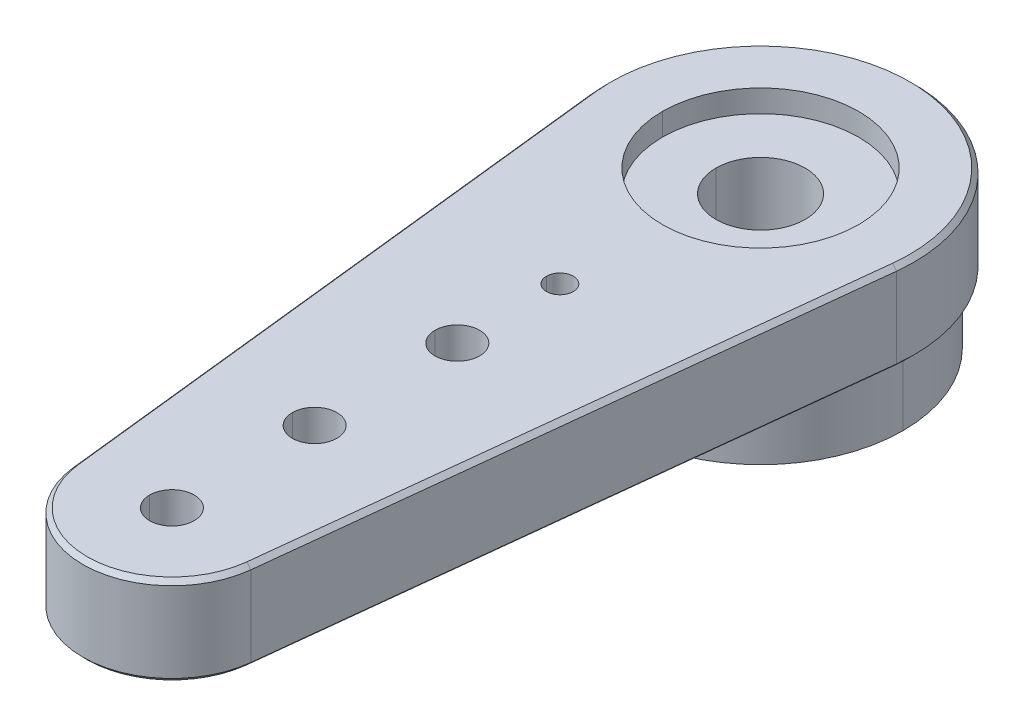
ISO-10303-21;
HEADER;
FILE_DESCRIPTION(('STEP AP214'),'2;1');
FILE_NAME('part.step','',(''),(''),'','','');
FILE_SCHEMA(('AUTOMOTIVE_DESIGN { 1 0 10303 214 1 1 1 1 }'));
ENDSEC;
DATA;
#1=APPLICATION_CONTEXT('core data for automotive mechanical design processes');
#2=APPLICATION_PROTOCOL_DEFINITION('international standard','automotive_design',2000,#1);
#3=PRODUCT_CONTEXT('',#1,'mechanical');
#4=PRODUCT('Part','Part','',(#3));
#5=PRODUCT_RELATED_PRODUCT_CATEGORY('part','',(#4));
#6=PRODUCT_DEFINITION_FORMATION('','',#4);
#7=PRODUCT_DEFINITION_CONTEXT('part definition',#1,'design');
#8=PRODUCT_DEFINITION('design','',#6,#7);
#9=PRODUCT_DEFINITION_SHAPE('','',#8);
#10=(LENGTH_UNIT() NAMED_UNIT(*) SI_UNIT(.MILLI.,.METRE.));
#11=(NAMED_UNIT(*) PLANE_ANGLE_UNIT() SI_UNIT($,.RADIAN.));
#12=(NAMED_UNIT(*) SI_UNIT($,.STERADIAN.) SOLID_ANGLE_UNIT());
#13=UNCERTAINTY_MEASURE_WITH_UNIT(LENGTH_MEASURE(1.E-05),#10,'distance_accuracy_value','');
#14=(GEOMETRIC_REPRESENTATION_CONTEXT(3) GLOBAL_UNCERTAINTY_ASSIGNED_CONTEXT((#13)) GLOBAL_UNIT_ASSIGNED_CONTEXT((#10,
#11,#12)) REPRESENTATION_CONTEXT('',''));
#15=CARTESIAN_POINT('',(0.,0.,0.));
#16=DIRECTION('',(0.,0.,1.));
#17=DIRECTION('',(1.,0.,0.));
#18=AXIS2_PLACEMENT_3D('',#15,#16,#17);
#19=CARTESIAN_POINT('',(11.9309891046794,-5.56745649207859,0.));
#20=DIRECTION('',(0.,1.,0.));
#21=DIRECTION('',(1.,0.,0.));
#22=AXIS2_PLACEMENT_3D('',#19,#20,#21);
#23=PLANE('',#22);
#24=CARTESIAN_POINT('',(6.68098910467936,-5.56745649207859,0.));
#25=DIRECTION('',(0.,1.,0.));
#26=DIRECTION('',(1.,0.,0.));
#27=AXIS2_PLACEMENT_3D('',#24,#25,#26);
#28=CIRCLE('',#27,2.);
#29=CARTESIAN_POINT('',(4.68098910467936,-5.56745649207859,0.));
#30=VERTEX_POINT('',#29);
#31=CARTESIAN_POINT('',(8.68098910467936,-5.56745649207859,0.));
#32=VERTEX_POINT('',#31);
#33=EDGE_CURVE('E149',#30,#32,#28,.T.);
#34=ORIENTED_EDGE('',*,*,#33,.T.);
#35=CARTESIAN_POINT('',(6.68098910467936,-5.56745649207859,0.));
#36=DIRECTION('',(0.,1.,0.));
#37=DIRECTION('',(1.,0.,0.));
#38=AXIS2_PLACEMENT_3D('',#35,#36,#37);
#39=CIRCLE('',#38,2.);
#40=EDGE_CURVE('E12',#32,#30,#39,.T.);
#41=ORIENTED_EDGE('',*,*,#40,.T.);
#42=EDGE_LOOP('',(#34,#41));
#43=FACE_BOUND('',#42,.T.);
#44=CARTESIAN_POINT('',(6.68098910467936,-5.56745649207859,0.));
#45=DIRECTION('',(0.,1.,0.));
#46=DIRECTION('',(1.,0.,0.));
#47=AXIS2_PLACEMENT_3D('',#44,#45,#46);
#48=CIRCLE('',#47,3.2);
#49=CARTESIAN_POINT('',(3.48098910467936,-5.56745649207859,0.));
#50=VERTEX_POINT('',#49);
#51=CARTESIAN_POINT('',(9.88098910467935,-5.56745649207859,0.));
#52=VERTEX_POINT('',#51);
#53=EDGE_CURVE('E382',#50,#52,#48,.T.);
#54=ORIENTED_EDGE('',*,*,#53,.F.);
#55=CARTESIAN_POINT('',(6.68098910467936,-5.56745649207859,0.));
#56=DIRECTION('',(0.,1.,0.));
#57=DIRECTION('',(1.,0.,0.));
#58=AXIS2_PLACEMENT_3D('',#55,#56,#57);
#59=CIRCLE('',#58,3.2);
#60=EDGE_CURVE('E165',#52,#50,#59,.T.);
#61=ORIENTED_EDGE('',*,*,#60,.F.);
#62=EDGE_LOOP('',(#54,#61));
#63=FACE_BOUND('',#62,.T.);
#64=ADVANCED_FACE('F20',(#43,#63),#23,.F.);
#65=CARTESIAN_POINT('',(6.68098910467936,-5.91745889207859,0.));
#66=DIRECTION('',(0.,1.,0.));
#67=DIRECTION('',(1.,0.,0.));
#68=AXIS2_PLACEMENT_3D('',#65,#66,#67);
#69=CYLINDRICAL_SURFACE('',#68,1.);
#70=DIRECTION('',(0.,1.,0.));
#71=VECTOR('',#70,1.);
#72=CARTESIAN_POINT('',(7.68098910467936,-5.91745889207859,0.));
#73=LINE('',#72,#71);
#74=CARTESIAN_POINT('',(7.68098910467936,-4.06745649207859,0.));
#75=VERTEX_POINT('',#74);
#76=CARTESIAN_POINT('',(7.68098910467936,-2.56745649207859,0.));
#77=VERTEX_POINT('',#76);
#78=EDGE_CURVE('E29',#75,#77,#73,.T.);
#79=ORIENTED_EDGE('',*,*,#78,.T.);
#80=CARTESIAN_POINT('',(6.68098910467936,-2.56745649207859,0.));
#81=DIRECTION('',(0.,1.,0.));
#82=DIRECTION('',(1.,0.,0.));
#83=AXIS2_PLACEMENT_3D('',#80,#81,#82);
#84=CIRCLE('',#83,1.);
#85=CARTESIAN_POINT('',(5.68098910467936,-2.56745649207859,0.));
#86=VERTEX_POINT('',#85);
#87=EDGE_CURVE('E186',#77,#86,#84,.T.);
#88=ORIENTED_EDGE('',*,*,#87,.T.);
#89=DIRECTION('',(0.,1.,0.));
#90=VECTOR('',#89,1.);
#91=CARTESIAN_POINT('',(5.68098910467936,-5.91745889207859,0.));
#92=LINE('',#91,#90);
#93=CARTESIAN_POINT('',(5.68098910467936,-4.06745649207859,0.));
#94=VERTEX_POINT('',#93);
#95=EDGE_CURVE('E51',#94,#86,#92,.T.);
#96=ORIENTED_EDGE('',*,*,#95,.F.);
#97=CARTESIAN_POINT('',(6.68098910467936,-4.06745649207859,0.));
#98=DIRECTION('',(0.,1.,0.));
#99=DIRECTION('',(1.,0.,0.));
#100=AXIS2_PLACEMENT_3D('',#97,#98,#99);
#101=CIRCLE('',#100,1.);
#102=EDGE_CURVE('E174',#75,#94,#101,.T.);
#103=ORIENTED_EDGE('',*,*,#102,.F.);
#104=EDGE_LOOP('',(#79,#88,#96,#103));
#105=FACE_BOUND('',#104,.T.);
#106=ADVANCED_FACE('F557',(#105),#69,.F.);
#107=CARTESIAN_POINT('',(6.68098910467936,-5.56745649207859,0.));
#108=DIRECTION('',(0.,1.,0.));
#109=DIRECTION('',(1.,0.,0.));
#110=AXIS2_PLACEMENT_3D('',#107,#108,#109);
#111=CYLINDRICAL_SURFACE('',#110,2.);
#112=DIRECTION('',(0.,1.,0.));
#113=VECTOR('',#112,1.);
#114=CARTESIAN_POINT('',(8.68098910467936,-5.56745649207859,0.));
#115=LINE('',#114,#113);
#116=CARTESIAN_POINT('',(8.68098910467936,-4.06745649207859,0.));
#117=VERTEX_POINT('',#116);
#118=EDGE_CURVE('E141',#32,#117,#115,.T.);
#119=ORIENTED_EDGE('',*,*,#118,.T.);
#120=CARTESIAN_POINT('',(6.68098910467936,-4.06745649207859,0.));
#121=DIRECTION('',(0.,1.,0.));
#122=DIRECTION('',(1.,0.,0.));
#123=AXIS2_PLACEMENT_3D('',#120,#121,#122);
#124=CIRCLE('',#123,2.);
#125=CARTESIAN_POINT('',(4.68098910467936,-4.06745649207859,0.));
#126=VERTEX_POINT('',#125);
#127=EDGE_CURVE('E170',#117,#126,#124,.T.);
#128=ORIENTED_EDGE('',*,*,#127,.T.);
#129=DIRECTION('',(0.,1.,0.));
#130=VECTOR('',#129,1.);
#131=CARTESIAN_POINT('',(4.68098910467936,-5.56745649207859,0.));
#132=LINE('',#131,#130);
#133=EDGE_CURVE('E148',#30,#126,#132,.T.);
#134=ORIENTED_EDGE('',*,*,#133,.F.);
#135=ORIENTED_EDGE('',*,*,#40,.F.);
#136=EDGE_LOOP('',(#119,#128,#134,#135));
#137=FACE_BOUND('',#136,.T.);
#138=ADVANCED_FACE('F143',(#137),#111,.F.);
#139=CARTESIAN_POINT('',(6.68098910467936,-5.91745889207859,0.));
#140=DIRECTION('',(0.,1.,0.));
#141=DIRECTION('',(1.,0.,0.));
#142=AXIS2_PLACEMENT_3D('',#139,#140,#141);
#143=CYLINDRICAL_SURFACE('',#142,1.);
#144=CARTESIAN_POINT('',(6.68098910467936,-4.06745649207859,0.));
#145=DIRECTION('',(0.,1.,0.));
#146=DIRECTION('',(1.,0.,0.));
#147=AXIS2_PLACEMENT_3D('',#144,#145,#146);
#148=CIRCLE('',#147,1.);
#149=EDGE_CURVE('E168',#94,#75,#148,.T.);
#150=ORIENTED_EDGE('',*,*,#149,.F.);
#151=ORIENTED_EDGE('',*,*,#95,.T.);
#152=CARTESIAN_POINT('',(6.68098910467936,-2.56745649207859,0.));
#153=DIRECTION('',(0.,1.,0.));
#154=DIRECTION('',(1.,0.,0.));
#155=AXIS2_PLACEMENT_3D('',#152,#153,#154);
#156=CIRCLE('',#155,1.);
#157=EDGE_CURVE('E271',#86,#77,#156,.T.);
#158=ORIENTED_EDGE('',*,*,#157,.T.);
#159=ORIENTED_EDGE('',*,*,#78,.F.);
#160=EDGE_LOOP('',(#150,#151,#158,#159));
#161=FACE_BOUND('',#160,.T.);
#162=ADVANCED_FACE('F570',(#161),#143,.F.);
#163=CARTESIAN_POINT('',(11.9309891046794,-4.06745649207859,0.));
#164=DIRECTION('',(0.,1.,0.));
#165=DIRECTION('',(1.,0.,0.));
#166=AXIS2_PLACEMENT_3D('',#163,#164,#165);
#167=PLANE('',#166);
#168=ORIENTED_EDGE('',*,*,#149,.T.);
#169=ORIENTED_EDGE('',*,*,#102,.T.);
#170=EDGE_LOOP('',(#168,#169));
#171=FACE_BOUND('',#170,.T.);
#172=CARTESIAN_POINT('',(6.68098910467936,-4.06745649207859,0.));
#173=DIRECTION('',(0.,1.,0.));
#174=DIRECTION('',(1.,0.,0.));
#175=AXIS2_PLACEMENT_3D('',#172,#173,#174);
#176=CIRCLE('',#175,2.);
#177=EDGE_CURVE('E156',#126,#117,#176,.T.);
#178=ORIENTED_EDGE('',*,*,#177,.F.);
#179=ORIENTED_EDGE('',*,*,#127,.F.);
#180=EDGE_LOOP('',(#178,#179));
#181=FACE_BOUND('',#180,.T.);
#182=ADVANCED_FACE('F567',(#171,#181),#167,.F.);
#183=CARTESIAN_POINT('',(6.68098910467936,-5.56745649207859,0.));
#184=DIRECTION('',(0.,1.,0.));
#185=DIRECTION('',(1.,0.,0.));
#186=AXIS2_PLACEMENT_3D('',#183,#184,#185);
#187=CYLINDRICAL_SURFACE('',#186,2.);
#188=ORIENTED_EDGE('',*,*,#177,.T.);
#189=ORIENTED_EDGE('',*,*,#118,.F.);
#190=ORIENTED_EDGE('',*,*,#33,.F.);
#191=ORIENTED_EDGE('',*,*,#133,.T.);
#192=EDGE_LOOP('',(#188,#189,#190,#191));
#193=FACE_BOUND('',#192,.T.);
#194=ADVANCED_FACE('F152',(#193),#187,.F.);
#195=CARTESIAN_POINT('',(6.68098910467936,-4.06745649207859,10.));
#196=DIRECTION('',(0.,1.,0.));
#197=DIRECTION('',(1.,0.,0.));
#198=AXIS2_PLACEMENT_3D('',#195,#196,#197);
#199=CYLINDRICAL_SURFACE('',#198,0.5);
#200=DIRECTION('',(0.,1.,0.));
#201=VECTOR('',#200,1.);
#202=CARTESIAN_POINT('',(7.18098910467936,-4.06745649207859,10.));
#203=LINE('',#202,#201);
#204=CARTESIAN_POINT('',(7.18098910467936,-4.06745649207859,10.));
#205=VERTEX_POINT('',#204);
#206=CARTESIAN_POINT('',(7.18098910467936,-2.06745649207859,10.));
#207=VERTEX_POINT('',#206);
#208=EDGE_CURVE('E309',#205,#207,#203,.T.);
#209=ORIENTED_EDGE('',*,*,#208,.T.);
#210=CARTESIAN_POINT('',(6.68098910467936,-2.06745649207859,10.));
#211=DIRECTION('',(0.,1.,0.));
#212=DIRECTION('',(1.,0.,0.));
#213=AXIS2_PLACEMENT_3D('',#210,#211,#212);
#214=CIRCLE('',#213,0.5);
#215=CARTESIAN_POINT('',(6.18098910467936,-2.06745649207859,10.));
#216=VERTEX_POINT('',#215);
#217=EDGE_CURVE('E243',#207,#216,#214,.T.);
#218=ORIENTED_EDGE('',*,*,#217,.T.);
#219=DIRECTION('',(0.,1.,0.));
#220=VECTOR('',#219,1.);
#221=CARTESIAN_POINT('',(6.18098910467936,-4.06745649207859,10.));
#222=LINE('',#221,#220);
#223=CARTESIAN_POINT('',(6.18098910467936,-4.06745649207859,10.));
#224=VERTEX_POINT('',#223);
#225=EDGE_CURVE('E311',#224,#216,#222,.T.);
#226=ORIENTED_EDGE('',*,*,#225,.F.);
#227=CARTESIAN_POINT('',(6.68098910467936,-4.06745649207859,10.));
#228=DIRECTION('',(0.,1.,0.));
#229=DIRECTION('',(1.,0.,0.));
#230=AXIS2_PLACEMENT_3D('',#227,#228,#229);
#231=CIRCLE('',#230,0.5);
#232=EDGE_CURVE('E353',#205,#224,#231,.T.);
#233=ORIENTED_EDGE('',*,*,#232,.F.);
#234=EDGE_LOOP('',(#209,#218,#226,#233));
#235=FACE_BOUND('',#234,.T.);
#236=ADVANCED_FACE('F574',(#235),#199,.F.);
#237=CARTESIAN_POINT('',(6.68098910467936,-4.06745649207859,4.5));
#238=DIRECTION('',(0.,1.,0.));
#239=DIRECTION('',(1.,0.,0.));
#240=AXIS2_PLACEMENT_3D('',#237,#238,#239);
#241=CYLINDRICAL_SURFACE('',#240,0.3);
#242=DIRECTION('',(0.,1.,0.));
#243=VECTOR('',#242,1.);
#244=CARTESIAN_POINT('',(6.98098910467936,-4.06745649207859,4.5));
#245=LINE('',#244,#243);
#246=CARTESIAN_POINT('',(6.98098910467936,-4.06745649207859,4.5));
#247=VERTEX_POINT('',#246);
#248=CARTESIAN_POINT('',(6.98098910467936,-2.06745649207859,4.5));
#249=VERTEX_POINT('',#248);
#250=EDGE_CURVE('E255',#247,#249,#245,.T.);
#251=ORIENTED_EDGE('',*,*,#250,.T.);
#252=CARTESIAN_POINT('',(6.68098910467936,-2.06745649207859,4.5));
#253=DIRECTION('',(0.,1.,0.));
#254=DIRECTION('',(1.,0.,0.));
#255=AXIS2_PLACEMENT_3D('',#252,#253,#254);
#256=CIRCLE('',#255,0.3);
#257=CARTESIAN_POINT('',(6.38098910467936,-2.06745649207859,4.5));
#258=VERTEX_POINT('',#257);
#259=EDGE_CURVE('E256',#249,#258,#256,.T.);
#260=ORIENTED_EDGE('',*,*,#259,.T.);
#261=DIRECTION('',(0.,1.,0.));
#262=VECTOR('',#261,1.);
#263=CARTESIAN_POINT('',(6.38098910467936,-4.06745649207859,4.5));
#264=LINE('',#263,#262);
#265=CARTESIAN_POINT('',(6.38098910467936,-4.06745649207859,4.5));
#266=VERTEX_POINT('',#265);
#267=EDGE_CURVE('E260',#266,#258,#264,.T.);
#268=ORIENTED_EDGE('',*,*,#267,.F.);
#269=CARTESIAN_POINT('',(6.68098910467936,-4.06745649207859,4.5));
#270=DIRECTION('',(0.,1.,0.));
#271=DIRECTION('',(1.,0.,0.));
#272=AXIS2_PLACEMENT_3D('',#269,#270,#271);
#273=CIRCLE('',#272,0.3);
#274=EDGE_CURVE('E235',#247,#266,#273,.T.);
#275=ORIENTED_EDGE('',*,*,#274,.F.);
#276=EDGE_LOOP('',(#251,#260,#268,#275));
#277=FACE_BOUND('',#276,.T.);
#278=ADVANCED_FACE('F579',(#277),#241,.F.);
#279=CARTESIAN_POINT('',(6.68098910467936,-4.06745649207859,13.2));
#280=DIRECTION('',(0.,1.,0.));
#281=DIRECTION('',(1.,0.,0.));
#282=AXIS2_PLACEMENT_3D('',#279,#280,#281);
#283=CYLINDRICAL_SURFACE('',#282,0.5);
#284=DIRECTION('',(0.,1.,0.));
#285=VECTOR('',#284,1.);
#286=CARTESIAN_POINT('',(7.18098910467936,-4.06745649207859,13.2));
#287=LINE('',#286,#285);
#288=CARTESIAN_POINT('',(7.18098910467936,-4.06745649207859,13.2));
#289=VERTEX_POINT('',#288);
#290=CARTESIAN_POINT('',(7.18098910467936,-2.06745649207859,13.2));
#291=VERTEX_POINT('',#290);
#292=EDGE_CURVE('E301',#289,#291,#287,.T.);
#293=ORIENTED_EDGE('',*,*,#292,.T.);
#294=CARTESIAN_POINT('',(6.68098910467936,-2.06745649207859,13.2));
#295=DIRECTION('',(0.,1.,0.));
#296=DIRECTION('',(1.,0.,0.));
#297=AXIS2_PLACEMENT_3D('',#294,#295,#296);
#298=CIRCLE('',#297,0.5);
#299=CARTESIAN_POINT('',(6.18098910467936,-2.06745649207859,13.2));
#300=VERTEX_POINT('',#299);
#301=EDGE_CURVE('E277',#291,#300,#298,.T.);
#302=ORIENTED_EDGE('',*,*,#301,.T.);
#303=DIRECTION('',(0.,1.,0.));
#304=VECTOR('',#303,1.);
#305=CARTESIAN_POINT('',(6.18098910467936,-4.06745649207859,13.2));
#306=LINE('',#305,#304);
#307=CARTESIAN_POINT('',(6.18098910467936,-4.06745649207859,13.2));
#308=VERTEX_POINT('',#307);
#309=EDGE_CURVE('E298',#308,#300,#306,.T.);
#310=ORIENTED_EDGE('',*,*,#309,.F.);
#311=CARTESIAN_POINT('',(6.68098910467936,-4.06745649207859,13.2));
#312=DIRECTION('',(0.,1.,0.));
#313=DIRECTION('',(1.,0.,0.));
#314=AXIS2_PLACEMENT_3D('',#311,#312,#313);
#315=CIRCLE('',#314,0.5);
#316=EDGE_CURVE('E535',#289,#308,#315,.T.);
#317=ORIENTED_EDGE('',*,*,#316,.F.);
#318=EDGE_LOOP('',(#293,#302,#310,#317));
#319=FACE_BOUND('',#318,.T.);
#320=ADVANCED_FACE('F530',(#319),#283,.F.);
#321=CARTESIAN_POINT('',(6.68098910467936,-5.56745649207859,0.));
#322=DIRECTION('',(0.,1.,0.));
#323=DIRECTION('',(1.,0.,0.));
#324=AXIS2_PLACEMENT_3D('',#321,#322,#323);
#325=CYLINDRICAL_SURFACE('',#324,3.2);
#326=DIRECTION('',(0.,1.,0.));
#327=VECTOR('',#326,1.);
#328=CARTESIAN_POINT('',(9.88098910467935,-5.56745649207859,0.));
#329=LINE('',#328,#327);
#330=CARTESIAN_POINT('',(9.88098910467935,-4.06745649207859,0.));
#331=VERTEX_POINT('',#330);
#332=EDGE_CURVE('E387',#52,#331,#329,.T.);
#333=ORIENTED_EDGE('',*,*,#332,.F.);
#334=ORIENTED_EDGE('',*,*,#60,.T.);
#335=DIRECTION('',(0.,1.,0.));
#336=VECTOR('',#335,1.);
#337=CARTESIAN_POINT('',(3.48098910467936,-5.56745649207859,0.));
#338=LINE('',#337,#336);
#339=CARTESIAN_POINT('',(3.48098910467936,-4.06745649207859,0.));
#340=VERTEX_POINT('',#339);
#341=EDGE_CURVE('E390',#50,#340,#338,.T.);
#342=ORIENTED_EDGE('',*,*,#341,.T.);
#343=CARTESIAN_POINT('',(6.68098910467936,-4.06745649207859,0.));
#344=DIRECTION('',(0.,1.,0.));
#345=DIRECTION('',(1.,0.,0.));
#346=AXIS2_PLACEMENT_3D('',#343,#344,#345);
#347=CIRCLE('',#346,3.2);
#348=EDGE_CURVE('E357',#331,#340,#347,.T.);
#349=ORIENTED_EDGE('',*,*,#348,.F.);
#350=EDGE_LOOP('',(#333,#334,#342,#349));
#351=FACE_BOUND('',#350,.T.);
#352=ADVANCED_FACE('F584',(#351),#325,.T.);
#353=CARTESIAN_POINT('',(6.68098910467936,-4.06745649207859,6.8));
#354=DIRECTION('',(0.,1.,0.));
#355=DIRECTION('',(1.,0.,0.));
#356=AXIS2_PLACEMENT_3D('',#353,#354,#355);
#357=CYLINDRICAL_SURFACE('',#356,0.5);
#358=DIRECTION('',(0.,1.,0.));
#359=VECTOR('',#358,1.);
#360=CARTESIAN_POINT('',(7.18098910467936,-4.06745649207859,6.8));
#361=LINE('',#360,#359);
#362=CARTESIAN_POINT('',(7.18098910467936,-4.06745649207859,6.8));
#363=VERTEX_POINT('',#362);
#364=CARTESIAN_POINT('',(7.18098910467936,-2.06745649207859,6.8));
#365=VERTEX_POINT('',#364);
#366=EDGE_CURVE('E304',#363,#365,#361,.T.);
#367=ORIENTED_EDGE('',*,*,#366,.T.);
#368=CARTESIAN_POINT('',(6.68098910467936,-2.06745649207859,6.8));
#369=DIRECTION('',(0.,1.,0.));
#370=DIRECTION('',(1.,0.,0.));
#371=AXIS2_PLACEMENT_3D('',#368,#369,#370);
#372=CIRCLE('',#371,0.5);
#373=CARTESIAN_POINT('',(6.18098910467936,-2.06745649207859,6.8));
#374=VERTEX_POINT('',#373);
#375=EDGE_CURVE('E281',#365,#374,#372,.T.);
#376=ORIENTED_EDGE('',*,*,#375,.T.);
#377=DIRECTION('',(0.,1.,0.));
#378=VECTOR('',#377,1.);
#379=CARTESIAN_POINT('',(6.18098910467936,-4.06745649207859,6.8));
#380=LINE('',#379,#378);
#381=CARTESIAN_POINT('',(6.18098910467936,-4.06745649207859,6.8));
#382=VERTEX_POINT('',#381);
#383=EDGE_CURVE('E307',#382,#374,#380,.T.);
#384=ORIENTED_EDGE('',*,*,#383,.F.);
#385=CARTESIAN_POINT('',(6.68098910467936,-4.06745649207859,6.8));
#386=DIRECTION('',(0.,1.,0.));
#387=DIRECTION('',(1.,0.,0.));
#388=AXIS2_PLACEMENT_3D('',#385,#386,#387);
#389=CIRCLE('',#388,0.5);
#390=EDGE_CURVE('E381',#363,#382,#389,.T.);
#391=ORIENTED_EDGE('',*,*,#390,.F.);
#392=EDGE_LOOP('',(#367,#376,#384,#391));
#393=FACE_BOUND('',#392,.T.);
#394=ADVANCED_FACE('F587',(#393),#357,.F.);
#395=CARTESIAN_POINT('',(6.68098910467936,-2.06745649207859,0.));
#396=DIRECTION('',(0.,1.,0.));
#397=DIRECTION('',(1.,0.,0.));
#398=AXIS2_PLACEMENT_3D('',#395,#396,#397);
#399=CYLINDRICAL_SURFACE('',#398,2.2);
#400=DIRECTION('',(0.,1.,0.));
#401=VECTOR('',#400,1.);
#402=CARTESIAN_POINT('',(8.88098910467935,-2.06745649207859,0.));
#403=LINE('',#402,#401);
#404=CARTESIAN_POINT('',(8.88098910467935,-2.56745649207859,0.));
#405=VERTEX_POINT('',#404);
#406=CARTESIAN_POINT('',(8.88098910467935,-2.06745649207859,0.));
#407=VERTEX_POINT('',#406);
#408=EDGE_CURVE('E187',#405,#407,#403,.T.);
#409=ORIENTED_EDGE('',*,*,#408,.T.);
#410=CARTESIAN_POINT('',(6.68098910467936,-2.06745649207859,0.));
#411=DIRECTION('',(0.,1.,0.));
#412=DIRECTION('',(1.,0.,0.));
#413=AXIS2_PLACEMENT_3D('',#410,#411,#412);
#414=CIRCLE('',#413,2.2);
#415=CARTESIAN_POINT('',(4.48098910467936,-2.06745649207859,0.));
#416=VERTEX_POINT('',#415);
#417=EDGE_CURVE('E288',#407,#416,#414,.T.);
#418=ORIENTED_EDGE('',*,*,#417,.T.);
#419=DIRECTION('',(0.,1.,0.));
#420=VECTOR('',#419,1.);
#421=CARTESIAN_POINT('',(4.48098910467936,-2.06745649207859,0.));
#422=LINE('',#421,#420);
#423=CARTESIAN_POINT('',(4.48098910467936,-2.56745649207859,0.));
#424=VERTEX_POINT('',#423);
#425=EDGE_CURVE('E192',#424,#416,#422,.T.);
#426=ORIENTED_EDGE('',*,*,#425,.F.);
#427=CARTESIAN_POINT('',(6.68098910467936,-2.56745649207859,0.));
#428=DIRECTION('',(0.,1.,0.));
#429=DIRECTION('',(1.,0.,0.));
#430=AXIS2_PLACEMENT_3D('',#427,#428,#429);
#431=CIRCLE('',#430,2.2);
#432=EDGE_CURVE('E270',#405,#424,#431,.T.);
#433=ORIENTED_EDGE('',*,*,#432,.F.);
#434=EDGE_LOOP('',(#409,#418,#426,#433));
#435=FACE_BOUND('',#434,.T.);
#436=ADVANCED_FACE('F593',(#435),#399,.F.);
#437=CARTESIAN_POINT('',(6.68098910467936,-4.06745649207859,13.2));
#438=DIRECTION('',(0.,1.,0.));
#439=DIRECTION('',(1.,0.,0.));
#440=AXIS2_PLACEMENT_3D('',#437,#438,#439);
#441=CONICAL_SURFACE('',#440,1.9,0.785398163397446);
#442=CARTESIAN_POINT('',(6.68098910467936,-4.06745649207859,13.2));
#443=DIRECTION('',(0.,1.,0.));
#444=DIRECTION('',(1.,0.,0.));
#445=AXIS2_PLACEMENT_3D('',#442,#443,#444);
#446=CIRCLE('',#445,1.9);
#447=CARTESIAN_POINT('',(4.79248725123596,-4.06745649207859,13.4087121212121));
#448=VERTEX_POINT('',#447);
#449=CARTESIAN_POINT('',(8.56949095812275,-4.06745649207859,13.4087121212121));
#450=VERTEX_POINT('',#449);
#451=EDGE_CURVE('E397',#448,#450,#446,.T.);
#452=ORIENTED_EDGE('',*,*,#451,.T.);
#453=DIRECTION('',(-0.702827614133257,-0.707106781186548,-0.0776746085394235));
#454=VECTOR('',#453,1.);
#455=CARTESIAN_POINT('',(8.6688857925145,-3.9674564920786,13.419696969697));
#456=LINE('',#455,#454);
#457=CARTESIAN_POINT('',(8.66888579251451,-3.96745649207859,13.419696969697));
#458=VERTEX_POINT('',#457);
#459=EDGE_CURVE('E201',#458,#450,#456,.T.);
#460=ORIENTED_EDGE('',*,*,#459,.F.);
#461=CARTESIAN_POINT('',(6.68098910467936,-3.96745649207859,13.2));
#462=DIRECTION('',(0.,1.,0.));
#463=DIRECTION('',(1.,0.,0.));
#464=AXIS2_PLACEMENT_3D('',#461,#462,#463);
#465=CIRCLE('',#464,2.);
#466=CARTESIAN_POINT('',(4.69309241684421,-3.9674564920786,13.419696969697));
#467=VERTEX_POINT('',#466);
#468=EDGE_CURVE('E242',#467,#458,#465,.T.);
#469=ORIENTED_EDGE('',*,*,#468,.F.);
#470=DIRECTION('',(-0.702827614133256,0.707106781186548,0.0776746085394359));
#471=VECTOR('',#470,1.);
#472=CARTESIAN_POINT('',(4.79248725123597,-4.0674564920786,13.4087121212121));
#473=LINE('',#472,#471);
#474=EDGE_CURVE('E210',#448,#467,#473,.T.);
#475=ORIENTED_EDGE('',*,*,#474,.F.);
#476=EDGE_LOOP('',(#452,#460,#469,#475));
#477=FACE_BOUND('',#476,.T.);
#478=ADVANCED_FACE('F600',(#477),#441,.T.);
#479=CARTESIAN_POINT('',(6.68098910467936,-4.06745649207859,0.));
#480=DIRECTION('',(0.,1.,0.));
#481=DIRECTION('',(1.,0.,0.));
#482=AXIS2_PLACEMENT_3D('',#479,#480,#481);
#483=CONICAL_SURFACE('',#482,3.35,0.785398163397448);
#484=CARTESIAN_POINT('',(6.68098910467936,-4.06745649207859,0.));
#485=DIRECTION('',(0.,1.,0.));
#486=DIRECTION('',(1.,0.,0.));
#487=AXIS2_PLACEMENT_3D('',#484,#485,#486);
#488=CIRCLE('',#487,3.35);
#489=CARTESIAN_POINT('',(10.0107160568032,-4.06745649207859,0.367992424242424));
#490=VERTEX_POINT('',#489);
#491=CARTESIAN_POINT('',(3.35126215255547,-4.06745649207859,0.367992424242423));
#492=VERTEX_POINT('',#491);
#493=EDGE_CURVE('E391',#490,#492,#488,.T.);
#494=ORIENTED_EDGE('',*,*,#493,.T.);
#495=DIRECTION('',(0.702827614133257,-0.707106781186548,-0.0776746085394298));
#496=VECTOR('',#495,1.);
#497=CARTESIAN_POINT('',(3.25186731816371,-3.96745649207858,0.378977272727272));
#498=LINE('',#497,#496);
#499=CARTESIAN_POINT('',(3.25186731816372,-3.96745649207859,0.37897727272727));
#500=VERTEX_POINT('',#499);
#501=EDGE_CURVE('E207',#500,#492,#498,.T.);
#502=ORIENTED_EDGE('',*,*,#501,.F.);
#503=CARTESIAN_POINT('',(6.68098910467936,-3.96745649207859,0.));
#504=DIRECTION('',(0.,1.,0.));
#505=DIRECTION('',(1.,0.,0.));
#506=AXIS2_PLACEMENT_3D('',#503,#504,#505);
#507=CIRCLE('',#506,3.45);
#508=CARTESIAN_POINT('',(10.110110891195,-3.96745649207859,0.378977272727272));
#509=VERTEX_POINT('',#508);
#510=EDGE_CURVE('E456',#509,#500,#507,.T.);
#511=ORIENTED_EDGE('',*,*,#510,.F.);
#512=DIRECTION('',(0.702827614133256,0.707106781186547,0.077674608539436));
#513=VECTOR('',#512,1.);
#514=CARTESIAN_POINT('',(10.0107160568032,-4.06745649207858,0.367992424242424));
#515=LINE('',#514,#513);
#516=EDGE_CURVE('E199',#490,#509,#515,.T.);
#517=ORIENTED_EDGE('',*,*,#516,.F.);
#518=EDGE_LOOP('',(#494,#502,#511,#517));
#519=FACE_BOUND('',#518,.T.);
#520=ADVANCED_FACE('F452',(#519),#483,.T.);
#521=CARTESIAN_POINT('',(4.02217728469984,-4.01745649207859,6.8938446969697));
#522=DIRECTION('',(0.702827614133257,0.707106781186547,-0.0776746085394314));
#523=DIRECTION('',(-0.109848484848485,0.,-0.993948343917576));
#524=AXIS2_PLACEMENT_3D('',#521,#522,#523);
#525=PLANE('',#524);
#526=DIRECTION('',(0.109848484848485,0.,0.993948343917576));
#527=VECTOR('',#526,1.);
#528=CARTESIAN_POINT('',(4.07187470189572,-4.06745649207859,6.88835227272727));
#529=LINE('',#528,#527);
#530=EDGE_CURVE('E395',#492,#448,#529,.T.);
#531=ORIENTED_EDGE('',*,*,#530,.T.);
#532=ORIENTED_EDGE('',*,*,#474,.T.);
#533=DIRECTION('',(0.109848484848485,0.,0.993948343917576));
#534=VECTOR('',#533,1.);
#535=CARTESIAN_POINT('',(3.97247986750396,-3.96745649207859,6.89933712121212));
#536=LINE('',#535,#534);
#537=EDGE_CURVE('E314',#500,#467,#536,.T.);
#538=ORIENTED_EDGE('',*,*,#537,.F.);
#539=ORIENTED_EDGE('',*,*,#501,.T.);
#540=EDGE_LOOP('',(#531,#532,#538,#539));
#541=FACE_BOUND('',#540,.T.);
#542=ADVANCED_FACE('F601',(#541),#525,.F.);
#543=CARTESIAN_POINT('',(9.33980092465887,-4.01745649207859,6.8938446969697));
#544=DIRECTION('',(-0.702827614133257,0.707106781186547,-0.0776746085394314));
#545=DIRECTION('',(-0.109848484848485,0.,0.993948343917576));
#546=AXIS2_PLACEMENT_3D('',#543,#544,#545);
#547=PLANE('',#546);
#548=DIRECTION('',(0.109848484848485,0.,-0.993948343917576));
#549=VECTOR('',#548,1.);
#550=CARTESIAN_POINT('',(9.29010350746299,-4.06745649207859,6.88835227272727));
#551=LINE('',#550,#549);
#552=EDGE_CURVE('E393',#450,#490,#551,.T.);
#553=ORIENTED_EDGE('',*,*,#552,.T.);
#554=ORIENTED_EDGE('',*,*,#516,.T.);
#555=DIRECTION('',(0.109848484848485,0.,-0.993948343917576));
#556=VECTOR('',#555,1.);
#557=CARTESIAN_POINT('',(9.38949834185475,-3.96745649207859,6.89933712121212));
#558=LINE('',#557,#556);
#559=EDGE_CURVE('E399',#458,#509,#558,.T.);
#560=ORIENTED_EDGE('',*,*,#559,.F.);
#561=ORIENTED_EDGE('',*,*,#459,.T.);
#562=EDGE_LOOP('',(#553,#554,#560,#561));
#563=FACE_BOUND('',#562,.T.);
#564=ADVANCED_FACE('F446',(#563),#547,.F.);
#565=CARTESIAN_POINT('',(6.68098910467936,-2.06745649207859,0.));
#566=DIRECTION('',(0.,-1.,0.));
#567=DIRECTION('',(-1.,0.,0.));
#568=AXIS2_PLACEMENT_3D('',#565,#566,#567);
#569=CONICAL_SURFACE('',#568,3.35,0.785398163397448);
#570=CARTESIAN_POINT('',(6.68098910467936,-2.06745649207859,0.));
#571=DIRECTION('',(0.,1.,0.));
#572=DIRECTION('',(1.,0.,0.));
#573=AXIS2_PLACEMENT_3D('',#570,#571,#572);
#574=CIRCLE('',#573,3.35);
#575=CARTESIAN_POINT('',(10.0107160568032,-2.06745649207859,0.367992424242421));
#576=VERTEX_POINT('',#575);
#577=CARTESIAN_POINT('',(3.35126215255547,-2.0674564920786,0.367992424242424));
#578=VERTEX_POINT('',#577);
#579=EDGE_CURVE('E232',#576,#578,#574,.T.);
#580=ORIENTED_EDGE('',*,*,#579,.F.);
#581=DIRECTION('',(-0.702827614133256,0.707106781186547,-0.077674608539436));
#582=VECTOR('',#581,1.);
#583=CARTESIAN_POINT('',(10.110110891195,-2.1674564920786,0.378977272727273));
#584=LINE('',#583,#582);
#585=CARTESIAN_POINT('',(10.110110891195,-2.16745649207859,0.378977272727272));
#586=VERTEX_POINT('',#585);
#587=EDGE_CURVE('E198',#586,#576,#584,.T.);
#588=ORIENTED_EDGE('',*,*,#587,.F.);
#589=CARTESIAN_POINT('',(6.68098910467936,-2.16745649207859,0.));
#590=DIRECTION('',(0.,1.,0.));
#591=DIRECTION('',(1.,0.,0.));
#592=AXIS2_PLACEMENT_3D('',#589,#590,#591);
#593=CIRCLE('',#592,3.45);
#594=CARTESIAN_POINT('',(3.25186731816371,-2.1674564920786,0.378977272727272));
#595=VERTEX_POINT('',#594);
#596=EDGE_CURVE('E418',#586,#595,#593,.T.);
#597=ORIENTED_EDGE('',*,*,#596,.T.);
#598=DIRECTION('',(-0.702827614133257,-0.707106781186548,0.0776746085394298));
#599=VECTOR('',#598,1.);
#600=CARTESIAN_POINT('',(3.35126215255547,-2.0674564920786,0.367992424242424));
#601=LINE('',#600,#599);
#602=EDGE_CURVE('E195',#578,#595,#601,.T.);
#603=ORIENTED_EDGE('',*,*,#602,.F.);
#604=EDGE_LOOP('',(#580,#588,#597,#603));
#605=FACE_BOUND('',#604,.T.);
#606=ADVANCED_FACE('F607',(#605),#569,.T.);
#607=CARTESIAN_POINT('',(6.68098910467936,-2.06745649207859,13.2));
#608=DIRECTION('',(0.,-1.,0.));
#609=DIRECTION('',(-1.,0.,0.));
#610=AXIS2_PLACEMENT_3D('',#607,#608,#609);
#611=CONICAL_SURFACE('',#610,1.9,0.785398163397446);
#612=CARTESIAN_POINT('',(6.68098910467936,-2.06745649207859,13.2));
#613=DIRECTION('',(0.,1.,0.));
#614=DIRECTION('',(1.,0.,0.));
#615=AXIS2_PLACEMENT_3D('',#612,#613,#614);
#616=CIRCLE('',#615,1.9);
#617=CARTESIAN_POINT('',(4.79248725123596,-2.06745649207859,13.4087121212121));
#618=VERTEX_POINT('',#617);
#619=CARTESIAN_POINT('',(8.56949095812275,-2.06745649207859,13.4087121212121));
#620=VERTEX_POINT('',#619);
#621=EDGE_CURVE('E251',#618,#620,#616,.T.);
#622=ORIENTED_EDGE('',*,*,#621,.F.);
#623=DIRECTION('',(0.702827614133256,0.707106781186547,-0.077674608539436));
#624=VECTOR('',#623,1.);
#625=CARTESIAN_POINT('',(4.69309241684421,-2.16745649207858,13.419696969697));
#626=LINE('',#625,#624);
#627=CARTESIAN_POINT('',(4.69309241684421,-2.16745649207858,13.419696969697));
#628=VERTEX_POINT('',#627);
#629=EDGE_CURVE('E193',#628,#618,#626,.T.);
#630=ORIENTED_EDGE('',*,*,#629,.F.);
#631=CARTESIAN_POINT('',(6.68098910467936,-2.16745649207859,13.2));
#632=DIRECTION('',(0.,1.,0.));
#633=DIRECTION('',(1.,0.,0.));
#634=AXIS2_PLACEMENT_3D('',#631,#632,#633);
#635=CIRCLE('',#634,2.);
#636=CARTESIAN_POINT('',(8.66888579251451,-2.16745649207858,13.419696969697));
#637=VERTEX_POINT('',#636);
#638=EDGE_CURVE('E238',#628,#637,#635,.T.);
#639=ORIENTED_EDGE('',*,*,#638,.T.);
#640=DIRECTION('',(0.702827614133257,-0.707106781186548,0.0776746085394235));
#641=VECTOR('',#640,1.);
#642=CARTESIAN_POINT('',(8.56949095812274,-2.06745649207858,13.4087121212121));
#643=LINE('',#642,#641);
#644=EDGE_CURVE('E189',#620,#637,#643,.T.);
#645=ORIENTED_EDGE('',*,*,#644,.F.);
#646=EDGE_LOOP('',(#622,#630,#639,#645));
#647=FACE_BOUND('',#646,.T.);
#648=ADVANCED_FACE('F611',(#647),#611,.T.);
#649=CARTESIAN_POINT('',(4.02217728469984,-2.11745649207859,6.8938446969697));
#650=DIRECTION('',(-0.702827614133257,0.707106781186547,0.0776746085394314));
#651=DIRECTION('',(0.109848484848485,0.,0.993948343917576));
#652=AXIS2_PLACEMENT_3D('',#649,#650,#651);
#653=PLANE('',#652);
#654=DIRECTION('',(0.109848484848485,0.,0.993948343917576));
#655=VECTOR('',#654,1.);
#656=CARTESIAN_POINT('',(4.07187470189572,-2.06745649207859,6.88835227272727));
#657=LINE('',#656,#655);
#658=EDGE_CURVE('E236',#578,#618,#657,.T.);
#659=ORIENTED_EDGE('',*,*,#658,.F.);
#660=ORIENTED_EDGE('',*,*,#602,.T.);
#661=DIRECTION('',(0.109848484848485,0.,0.993948343917576));
#662=VECTOR('',#661,1.);
#663=CARTESIAN_POINT('',(3.97247986750396,-2.16745649207859,6.89933712121212));
#664=LINE('',#663,#662);
#665=EDGE_CURVE('E317',#595,#628,#664,.T.);
#666=ORIENTED_EDGE('',*,*,#665,.T.);
#667=ORIENTED_EDGE('',*,*,#629,.T.);
#668=EDGE_LOOP('',(#659,#660,#666,#667));
#669=FACE_BOUND('',#668,.T.);
#670=ADVANCED_FACE('F625',(#669),#653,.T.);
#671=CARTESIAN_POINT('',(9.33980092465887,-2.11745649207859,6.8938446969697));
#672=DIRECTION('',(0.702827614133257,0.707106781186547,0.0776746085394314));
#673=DIRECTION('',(0.109848484848485,0.,-0.993948343917576));
#674=AXIS2_PLACEMENT_3D('',#671,#672,#673);
#675=PLANE('',#674);
#676=DIRECTION('',(0.109848484848485,0.,-0.993948343917576));
#677=VECTOR('',#676,1.);
#678=CARTESIAN_POINT('',(9.29010350746299,-2.06745649207859,6.88835227272727));
#679=LINE('',#678,#677);
#680=EDGE_CURVE('E265',#620,#576,#679,.T.);
#681=ORIENTED_EDGE('',*,*,#680,.F.);
#682=ORIENTED_EDGE('',*,*,#644,.T.);
#683=DIRECTION('',(0.109848484848485,0.,-0.993948343917576));
#684=VECTOR('',#683,1.);
#685=CARTESIAN_POINT('',(9.38949834185475,-2.16745649207859,6.89933712121212));
#686=LINE('',#685,#684);
#687=EDGE_CURVE('E404',#637,#586,#686,.T.);
#688=ORIENTED_EDGE('',*,*,#687,.T.);
#689=ORIENTED_EDGE('',*,*,#587,.T.);
#690=EDGE_LOOP('',(#681,#682,#688,#689));
#691=FACE_BOUND('',#690,.T.);
#692=ADVANCED_FACE('F622',(#691),#675,.T.);
#693=CARTESIAN_POINT('',(6.68098910467936,-2.06745649207859,0.));
#694=DIRECTION('',(0.,1.,0.));
#695=DIRECTION('',(1.,0.,0.));
#696=AXIS2_PLACEMENT_3D('',#693,#694,#695);
#697=CYLINDRICAL_SURFACE('',#696,2.2);
#698=CARTESIAN_POINT('',(6.68098910467936,-2.56745649207859,0.));
#699=DIRECTION('',(0.,1.,0.));
#700=DIRECTION('',(1.,0.,0.));
#701=AXIS2_PLACEMENT_3D('',#698,#699,#700);
#702=CIRCLE('',#701,2.2);
#703=EDGE_CURVE('E275',#424,#405,#702,.T.);
#704=ORIENTED_EDGE('',*,*,#703,.F.);
#705=ORIENTED_EDGE('',*,*,#425,.T.);
#706=CARTESIAN_POINT('',(6.68098910467936,-2.06745649207859,0.));
#707=DIRECTION('',(0.,1.,0.));
#708=DIRECTION('',(1.,0.,0.));
#709=AXIS2_PLACEMENT_3D('',#706,#707,#708);
#710=CIRCLE('',#709,2.2);
#711=EDGE_CURVE('E249',#416,#407,#710,.T.);
#712=ORIENTED_EDGE('',*,*,#711,.T.);
#713=ORIENTED_EDGE('',*,*,#408,.F.);
#714=EDGE_LOOP('',(#704,#705,#712,#713));
#715=FACE_BOUND('',#714,.T.);
#716=ADVANCED_FACE('F620',(#715),#697,.F.);
#717=CARTESIAN_POINT('',(5.08171809054368,-2.56745649207859,6.89933712121212));
#718=DIRECTION('',(0.,1.,0.));
#719=DIRECTION('',(1.,0.,0.));
#720=AXIS2_PLACEMENT_3D('',#717,#718,#719);
#721=PLANE('',#720);
#722=ORIENTED_EDGE('',*,*,#157,.F.);
#723=ORIENTED_EDGE('',*,*,#87,.F.);
#724=EDGE_LOOP('',(#722,#723));
#725=FACE_BOUND('',#724,.T.);
#726=ORIENTED_EDGE('',*,*,#703,.T.);
#727=ORIENTED_EDGE('',*,*,#432,.T.);
#728=EDGE_LOOP('',(#726,#727));
#729=FACE_BOUND('',#728,.T.);
#730=ADVANCED_FACE('F614',(#725,#729),#721,.T.);
#731=CARTESIAN_POINT('',(4.6930924168442,-4.06745649207859,13.419696969697));
#732=DIRECTION('',(-0.993948343917576,0.,0.109848484848485));
#733=DIRECTION('',(0.,1.,0.));
#734=AXIS2_PLACEMENT_3D('',#731,#732,#733);
#735=PLANE('',#734);
#736=ORIENTED_EDGE('',*,*,#537,.T.);
#737=DIRECTION('',(0.,1.,0.));
#738=VECTOR('',#737,1.);
#739=CARTESIAN_POINT('',(4.6930924168442,-4.06745649207859,13.419696969697));
#740=LINE('',#739,#738);
#741=EDGE_CURVE('E245',#467,#628,#740,.T.);
#742=ORIENTED_EDGE('',*,*,#741,.T.);
#743=ORIENTED_EDGE('',*,*,#665,.F.);
#744=DIRECTION('',(0.,1.,0.));
#745=VECTOR('',#744,1.);
#746=CARTESIAN_POINT('',(3.25186731816372,-4.06745649207859,0.378977272727272));
#747=LINE('',#746,#745);
#748=EDGE_CURVE('E648',#500,#595,#747,.T.);
#749=ORIENTED_EDGE('',*,*,#748,.F.);
#750=EDGE_LOOP('',(#736,#742,#743,#749));
#751=FACE_BOUND('',#750,.T.);
#752=ADVANCED_FACE('F616',(#751),#735,.T.);
#753=CARTESIAN_POINT('',(6.68098910467936,-4.06745649207859,13.2));
#754=DIRECTION('',(0.,1.,0.));
#755=DIRECTION('',(1.,0.,0.));
#756=AXIS2_PLACEMENT_3D('',#753,#754,#755);
#757=CYLINDRICAL_SURFACE('',#756,2.);
#758=ORIENTED_EDGE('',*,*,#468,.T.);
#759=DIRECTION('',(0.,1.,0.));
#760=VECTOR('',#759,1.);
#761=CARTESIAN_POINT('',(8.66888579251451,-4.06745649207859,13.419696969697));
#762=LINE('',#761,#760);
#763=EDGE_CURVE('E419',#458,#637,#762,.T.);
#764=ORIENTED_EDGE('',*,*,#763,.T.);
#765=ORIENTED_EDGE('',*,*,#638,.F.);
#766=ORIENTED_EDGE('',*,*,#741,.F.);
#767=EDGE_LOOP('',(#758,#764,#765,#766));
#768=FACE_BOUND('',#767,.T.);
#769=ADVANCED_FACE('F432',(#768),#757,.T.);
#770=CARTESIAN_POINT('',(10.110110891195,-4.06745649207859,0.378977272727272));
#771=DIRECTION('',(0.993948343917576,0.,0.109848484848485));
#772=DIRECTION('',(0.,-1.,0.));
#773=AXIS2_PLACEMENT_3D('',#770,#771,#772);
#774=PLANE('',#773);
#775=ORIENTED_EDGE('',*,*,#559,.T.);
#776=DIRECTION('',(0.,1.,0.));
#777=VECTOR('',#776,1.);
#778=CARTESIAN_POINT('',(10.110110891195,-4.06745649207859,0.378977272727272));
#779=LINE('',#778,#777);
#780=EDGE_CURVE('E406',#509,#586,#779,.T.);
#781=ORIENTED_EDGE('',*,*,#780,.T.);
#782=ORIENTED_EDGE('',*,*,#687,.F.);
#783=ORIENTED_EDGE('',*,*,#763,.F.);
#784=EDGE_LOOP('',(#775,#781,#782,#783));
#785=FACE_BOUND('',#784,.T.);
#786=ADVANCED_FACE('F445',(#785),#774,.T.);
#787=CARTESIAN_POINT('',(6.68098910467936,-4.06745649207859,0.));
#788=DIRECTION('',(0.,1.,0.));
#789=DIRECTION('',(1.,0.,0.));
#790=AXIS2_PLACEMENT_3D('',#787,#788,#789);
#791=CYLINDRICAL_SURFACE('',#790,3.45);
#792=ORIENTED_EDGE('',*,*,#510,.T.);
#793=ORIENTED_EDGE('',*,*,#748,.T.);
#794=ORIENTED_EDGE('',*,*,#596,.F.);
#795=ORIENTED_EDGE('',*,*,#780,.F.);
#796=EDGE_LOOP('',(#792,#793,#794,#795));
#797=FACE_BOUND('',#796,.T.);
#798=ADVANCED_FACE('F629',(#797),#791,.T.);
#799=CARTESIAN_POINT('',(6.68098910467936,-4.06745649207859,10.));
#800=DIRECTION('',(0.,1.,0.));
#801=DIRECTION('',(1.,0.,0.));
#802=AXIS2_PLACEMENT_3D('',#799,#800,#801);
#803=CYLINDRICAL_SURFACE('',#802,0.5);
#804=CARTESIAN_POINT('',(6.68098910467936,-2.06745649207859,10.));
#805=DIRECTION('',(0.,1.,0.));
#806=DIRECTION('',(1.,0.,0.));
#807=AXIS2_PLACEMENT_3D('',#804,#805,#806);
#808=CIRCLE('',#807,0.5);
#809=EDGE_CURVE('E246',#216,#207,#808,.T.);
#810=ORIENTED_EDGE('',*,*,#809,.T.);
#811=ORIENTED_EDGE('',*,*,#208,.F.);
#812=CARTESIAN_POINT('',(6.68098910467936,-4.06745649207859,10.));
#813=DIRECTION('',(0.,1.,0.));
#814=DIRECTION('',(1.,0.,0.));
#815=AXIS2_PLACEMENT_3D('',#812,#813,#814);
#816=CIRCLE('',#815,0.5);
#817=EDGE_CURVE('E360',#224,#205,#816,.T.);
#818=ORIENTED_EDGE('',*,*,#817,.F.);
#819=ORIENTED_EDGE('',*,*,#225,.T.);
#820=EDGE_LOOP('',(#810,#811,#818,#819));
#821=FACE_BOUND('',#820,.T.);
#822=ADVANCED_FACE('F555',(#821),#803,.F.);
#823=CARTESIAN_POINT('',(6.68098910467936,-4.06745649207859,6.8));
#824=DIRECTION('',(0.,1.,0.));
#825=DIRECTION('',(1.,0.,0.));
#826=AXIS2_PLACEMENT_3D('',#823,#824,#825);
#827=CYLINDRICAL_SURFACE('',#826,0.5);
#828=CARTESIAN_POINT('',(6.68098910467936,-2.06745649207859,6.8));
#829=DIRECTION('',(0.,1.,0.));
#830=DIRECTION('',(1.,0.,0.));
#831=AXIS2_PLACEMENT_3D('',#828,#829,#830);
#832=CIRCLE('',#831,0.5);
#833=EDGE_CURVE('E278',#374,#365,#832,.T.);
#834=ORIENTED_EDGE('',*,*,#833,.T.);
#835=ORIENTED_EDGE('',*,*,#366,.F.);
#836=CARTESIAN_POINT('',(6.68098910467936,-4.06745649207859,6.8));
#837=DIRECTION('',(0.,1.,0.));
#838=DIRECTION('',(1.,0.,0.));
#839=AXIS2_PLACEMENT_3D('',#836,#837,#838);
#840=CIRCLE('',#839,0.5);
#841=EDGE_CURVE('E668',#382,#363,#840,.T.);
#842=ORIENTED_EDGE('',*,*,#841,.F.);
#843=ORIENTED_EDGE('',*,*,#383,.T.);
#844=EDGE_LOOP('',(#834,#835,#842,#843));
#845=FACE_BOUND('',#844,.T.);
#846=ADVANCED_FACE('F545',(#845),#827,.F.);
#847=CARTESIAN_POINT('',(6.68098910467936,-4.06745649207859,13.2));
#848=DIRECTION('',(0.,1.,0.));
#849=DIRECTION('',(1.,0.,0.));
#850=AXIS2_PLACEMENT_3D('',#847,#848,#849);
#851=CYLINDRICAL_SURFACE('',#850,0.5);
#852=CARTESIAN_POINT('',(6.68098910467936,-2.06745649207859,13.2));
#853=DIRECTION('',(0.,1.,0.));
#854=DIRECTION('',(1.,0.,0.));
#855=AXIS2_PLACEMENT_3D('',#852,#853,#854);
#856=CIRCLE('',#855,0.5);
#857=EDGE_CURVE('E266',#300,#291,#856,.T.);
#858=ORIENTED_EDGE('',*,*,#857,.T.);
#859=ORIENTED_EDGE('',*,*,#292,.F.);
#860=CARTESIAN_POINT('',(6.68098910467936,-4.06745649207859,13.2));
#861=DIRECTION('',(0.,1.,0.));
#862=DIRECTION('',(1.,0.,0.));
#863=AXIS2_PLACEMENT_3D('',#860,#861,#862);
#864=CIRCLE('',#863,0.5);
#865=EDGE_CURVE('E659',#308,#289,#864,.T.);
#866=ORIENTED_EDGE('',*,*,#865,.F.);
#867=ORIENTED_EDGE('',*,*,#309,.T.);
#868=EDGE_LOOP('',(#858,#859,#866,#867));
#869=FACE_BOUND('',#868,.T.);
#870=ADVANCED_FACE('F537',(#869),#851,.F.);
#871=CARTESIAN_POINT('',(6.68098910467936,-4.06745649207859,4.5));
#872=DIRECTION('',(0.,1.,0.));
#873=DIRECTION('',(1.,0.,0.));
#874=AXIS2_PLACEMENT_3D('',#871,#872,#873);
#875=CYLINDRICAL_SURFACE('',#874,0.3);
#876=CARTESIAN_POINT('',(6.68098910467936,-2.06745649207859,4.5));
#877=DIRECTION('',(0.,1.,0.));
#878=DIRECTION('',(1.,0.,0.));
#879=AXIS2_PLACEMENT_3D('',#876,#877,#878);
#880=CIRCLE('',#879,0.3);
#881=EDGE_CURVE('E291',#258,#249,#880,.T.);
#882=ORIENTED_EDGE('',*,*,#881,.T.);
#883=ORIENTED_EDGE('',*,*,#250,.F.);
#884=CARTESIAN_POINT('',(6.68098910467936,-4.06745649207859,4.5));
#885=DIRECTION('',(0.,1.,0.));
#886=DIRECTION('',(1.,0.,0.));
#887=AXIS2_PLACEMENT_3D('',#884,#885,#886);
#888=CIRCLE('',#887,0.3);
#889=EDGE_CURVE('E361',#266,#247,#888,.T.);
#890=ORIENTED_EDGE('',*,*,#889,.F.);
#891=ORIENTED_EDGE('',*,*,#267,.T.);
#892=EDGE_LOOP('',(#882,#883,#890,#891));
#893=FACE_BOUND('',#892,.T.);
#894=ADVANCED_FACE('F541',(#893),#875,.F.);
#895=CARTESIAN_POINT('',(11.9309891046794,-2.06745649207859,0.));
#896=DIRECTION('',(0.,1.,0.));
#897=DIRECTION('',(1.,0.,0.));
#898=AXIS2_PLACEMENT_3D('',#895,#896,#897);
#899=PLANE('',#898);
#900=ORIENTED_EDGE('',*,*,#881,.F.);
#901=ORIENTED_EDGE('',*,*,#259,.F.);
#902=EDGE_LOOP('',(#900,#901));
#903=FACE_BOUND('',#902,.T.);
#904=ORIENTED_EDGE('',*,*,#711,.F.);
#905=ORIENTED_EDGE('',*,*,#417,.F.);
#906=EDGE_LOOP('',(#904,#905));
#907=FACE_BOUND('',#906,.T.);
#908=ORIENTED_EDGE('',*,*,#809,.F.);
#909=ORIENTED_EDGE('',*,*,#217,.F.);
#910=EDGE_LOOP('',(#908,#909));
#911=FACE_BOUND('',#910,.T.);
#912=ORIENTED_EDGE('',*,*,#833,.F.);
#913=ORIENTED_EDGE('',*,*,#375,.F.);
#914=EDGE_LOOP('',(#912,#913));
#915=FACE_BOUND('',#914,.T.);
#916=ORIENTED_EDGE('',*,*,#857,.F.);
#917=ORIENTED_EDGE('',*,*,#301,.F.);
#918=EDGE_LOOP('',(#916,#917));
#919=FACE_BOUND('',#918,.T.);
#920=ORIENTED_EDGE('',*,*,#579,.T.);
#921=ORIENTED_EDGE('',*,*,#658,.T.);
#922=ORIENTED_EDGE('',*,*,#621,.T.);
#923=ORIENTED_EDGE('',*,*,#680,.T.);
#924=EDGE_LOOP('',(#920,#921,#922,#923));
#925=FACE_BOUND('',#924,.T.);
#926=ADVANCED_FACE('F540',(#903,#907,#911,#915,#919,#925),#899,.T.);
#927=CARTESIAN_POINT('',(11.9309891046794,-4.06745649207859,0.));
#928=DIRECTION('',(0.,1.,0.));
#929=DIRECTION('',(1.,0.,0.));
#930=AXIS2_PLACEMENT_3D('',#927,#928,#929);
#931=PLANE('',#930);
#932=ORIENTED_EDGE('',*,*,#889,.T.);
#933=ORIENTED_EDGE('',*,*,#274,.T.);
#934=EDGE_LOOP('',(#932,#933));
#935=FACE_BOUND('',#934,.T.);
#936=CARTESIAN_POINT('',(6.68098910467936,-4.06745649207859,0.));
#937=DIRECTION('',(0.,1.,0.));
#938=DIRECTION('',(1.,0.,0.));
#939=AXIS2_PLACEMENT_3D('',#936,#937,#938);
#940=CIRCLE('',#939,3.2);
#941=EDGE_CURVE('E952',#340,#331,#940,.T.);
#942=ORIENTED_EDGE('',*,*,#941,.T.);
#943=ORIENTED_EDGE('',*,*,#348,.T.);
#944=EDGE_LOOP('',(#942,#943));
#945=FACE_BOUND('',#944,.T.);
#946=ORIENTED_EDGE('',*,*,#817,.T.);
#947=ORIENTED_EDGE('',*,*,#232,.T.);
#948=EDGE_LOOP('',(#946,#947));
#949=FACE_BOUND('',#948,.T.);
#950=ORIENTED_EDGE('',*,*,#841,.T.);
#951=ORIENTED_EDGE('',*,*,#390,.T.);
#952=EDGE_LOOP('',(#950,#951));
#953=FACE_BOUND('',#952,.T.);
#954=ORIENTED_EDGE('',*,*,#865,.T.);
#955=ORIENTED_EDGE('',*,*,#316,.T.);
#956=EDGE_LOOP('',(#954,#955));
#957=FACE_BOUND('',#956,.T.);
#958=ORIENTED_EDGE('',*,*,#451,.F.);
#959=ORIENTED_EDGE('',*,*,#530,.F.);
#960=ORIENTED_EDGE('',*,*,#493,.F.);
#961=ORIENTED_EDGE('',*,*,#552,.F.);
#962=EDGE_LOOP('',(#958,#959,#960,#961));
#963=FACE_BOUND('',#962,.T.);
#964=ADVANCED_FACE('F677',(#935,#945,#949,#953,#957,#963),#931,.F.);
#965=CARTESIAN_POINT('',(6.68098910467936,-5.56745649207859,0.));
#966=DIRECTION('',(0.,1.,0.));
#967=DIRECTION('',(1.,0.,0.));
#968=AXIS2_PLACEMENT_3D('',#965,#966,#967);
#969=CYLINDRICAL_SURFACE('',#968,3.2);
#970=ORIENTED_EDGE('',*,*,#941,.F.);
#971=ORIENTED_EDGE('',*,*,#341,.F.);
#972=ORIENTED_EDGE('',*,*,#53,.T.);
#973=ORIENTED_EDGE('',*,*,#332,.T.);
#974=EDGE_LOOP('',(#970,#971,#972,#973));
#975=FACE_BOUND('',#974,.T.);
#976=ADVANCED_FACE('F695',(#975),#969,.T.);
#977=CLOSED_SHELL('',(#64,#106,#138,#162,#182,#194,#236,#278,#320,#352,#394,#436,#478,#520,#542,
#564,#606,#648,#670,#692,#716,#730,#752,#769,#786,#798,#822,#846,#870,#894,#926,#964,#976));
#978=MANIFOLD_SOLID_BREP('B1',#977);
#979=ADVANCED_BREP_SHAPE_REPRESENTATION('',(#18,#978),#14);
#980=SHAPE_DEFINITION_REPRESENTATION(#9,#979);
ENDSEC;
END-ISO-10303-21;
